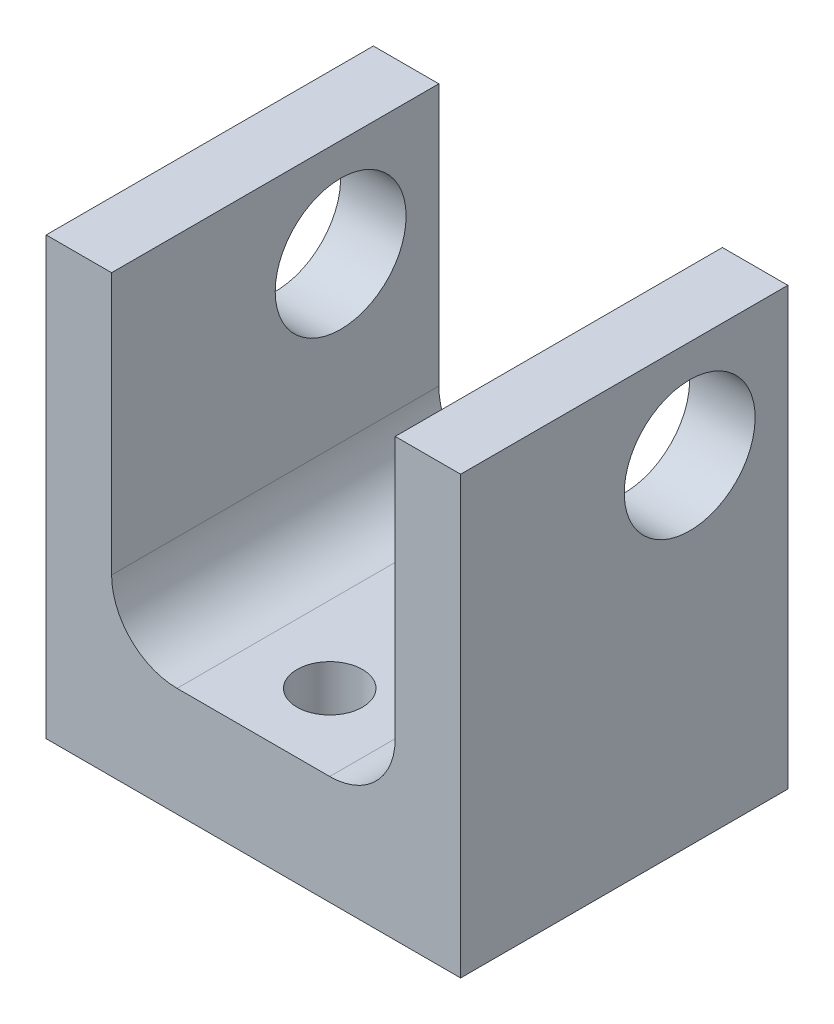
ISO-10303-21;
HEADER;
FILE_DESCRIPTION(('STEP AP214'),'2;1');
FILE_NAME('part.step','',(''),(''),'','','');
FILE_SCHEMA(('AUTOMOTIVE_DESIGN { 1 0 10303 214 1 1 1 1 }'));
ENDSEC;
DATA;
#1=APPLICATION_CONTEXT('core data for automotive mechanical design processes');
#2=APPLICATION_PROTOCOL_DEFINITION('international standard','automotive_design',2000,#1);
#3=PRODUCT_CONTEXT('',#1,'mechanical');
#4=PRODUCT('Part','Part','',(#3));
#5=PRODUCT_RELATED_PRODUCT_CATEGORY('part','',(#4));
#6=PRODUCT_DEFINITION_FORMATION('','',#4);
#7=PRODUCT_DEFINITION_CONTEXT('part definition',#1,'design');
#8=PRODUCT_DEFINITION('design','',#6,#7);
#9=PRODUCT_DEFINITION_SHAPE('','',#8);
#10=(LENGTH_UNIT() NAMED_UNIT(*) SI_UNIT(.MILLI.,.METRE.));
#11=(NAMED_UNIT(*) PLANE_ANGLE_UNIT() SI_UNIT($,.RADIAN.));
#12=(NAMED_UNIT(*) SI_UNIT($,.STERADIAN.) SOLID_ANGLE_UNIT());
#13=UNCERTAINTY_MEASURE_WITH_UNIT(LENGTH_MEASURE(1.E-05),#10,'distance_accuracy_value','');
#14=(GEOMETRIC_REPRESENTATION_CONTEXT(3) GLOBAL_UNCERTAINTY_ASSIGNED_CONTEXT((#13)) GLOBAL_UNIT_ASSIGNED_CONTEXT((#10,
#11,#12)) REPRESENTATION_CONTEXT('',''));
#15=CARTESIAN_POINT('',(0.,0.,0.));
#16=DIRECTION('',(0.,0.,1.));
#17=DIRECTION('',(1.,0.,0.));
#18=AXIS2_PLACEMENT_3D('',#15,#16,#17);
#19=CARTESIAN_POINT('',(9.5,0.,15.));
#20=DIRECTION('',(-1.,0.,0.));
#21=DIRECTION('',(0.,-1.,0.));
#22=AXIS2_PLACEMENT_3D('',#19,#20,#21);
#23=PLANE('',#22);
#24=CARTESIAN_POINT('',(9.49999999999999,15.5,4.5));
#25=DIRECTION('',(1.,0.,0.));
#26=DIRECTION('',(0.,1.,0.));
#27=AXIS2_PLACEMENT_3D('',#24,#25,#26);
#28=CIRCLE('',#27,3.);
#29=CARTESIAN_POINT('',(9.49999999999999,18.5,4.5));
#30=VERTEX_POINT('',#29);
#31=EDGE_CURVE('E174',#30,#30,#28,.T.);
#32=ORIENTED_EDGE('',*,*,#31,.F.);
#33=EDGE_LOOP('',(#32));
#34=FACE_BOUND('',#33,.T.);
#35=DIRECTION('',(0.,1.,0.));
#36=VECTOR('',#35,1.);
#37=CARTESIAN_POINT('',(9.5,0.,0.));
#38=LINE('',#37,#36);
#39=CARTESIAN_POINT('',(9.5,0.,0.));
#40=VERTEX_POINT('',#39);
#41=CARTESIAN_POINT('',(9.5,20.,0.));
#42=VERTEX_POINT('',#41);
#43=EDGE_CURVE('E143',#40,#42,#38,.T.);
#44=ORIENTED_EDGE('',*,*,#43,.T.);
#45=DIRECTION('',(0.,0.,-1.));
#46=VECTOR('',#45,1.);
#47=CARTESIAN_POINT('',(9.5,20.,15.));
#48=LINE('',#47,#46);
#49=CARTESIAN_POINT('',(9.5,20.,15.));
#50=VERTEX_POINT('',#49);
#51=EDGE_CURVE('E123',#50,#42,#48,.T.);
#52=ORIENTED_EDGE('',*,*,#51,.F.);
#53=DIRECTION('',(0.,1.,0.));
#54=VECTOR('',#53,1.);
#55=CARTESIAN_POINT('',(9.5,0.,15.));
#56=LINE('',#55,#54);
#57=CARTESIAN_POINT('',(9.5,0.,15.));
#58=VERTEX_POINT('',#57);
#59=EDGE_CURVE('E130',#58,#50,#56,.T.);
#60=ORIENTED_EDGE('',*,*,#59,.F.);
#61=DIRECTION('',(0.,0.,-1.));
#62=VECTOR('',#61,1.);
#63=CARTESIAN_POINT('',(9.5,0.,15.));
#64=LINE('',#63,#62);
#65=EDGE_CURVE('E220',#58,#40,#64,.T.);
#66=ORIENTED_EDGE('',*,*,#65,.T.);
#67=EDGE_LOOP('',(#44,#52,#60,#66));
#68=FACE_BOUND('',#67,.T.);
#69=ADVANCED_FACE('F39',(#34,#68),#23,.F.);
#70=CARTESIAN_POINT('',(9.5,20.,15.));
#71=DIRECTION('',(0.,-1.,0.));
#72=DIRECTION('',(1.,0.,0.));
#73=AXIS2_PLACEMENT_3D('',#70,#71,#72);
#74=PLANE('',#73);
#75=DIRECTION('',(-1.,0.,0.));
#76=VECTOR('',#75,1.);
#77=CARTESIAN_POINT('',(9.5,20.,0.));
#78=LINE('',#77,#76);
#79=CARTESIAN_POINT('',(6.5,20.,0.));
#80=VERTEX_POINT('',#79);
#81=EDGE_CURVE('E223',#42,#80,#78,.T.);
#82=ORIENTED_EDGE('',*,*,#81,.T.);
#83=DIRECTION('',(0.,0.,-1.));
#84=VECTOR('',#83,1.);
#85=CARTESIAN_POINT('',(6.5,20.,15.));
#86=LINE('',#85,#84);
#87=CARTESIAN_POINT('',(6.5,20.,15.));
#88=VERTEX_POINT('',#87);
#89=EDGE_CURVE('E126',#88,#80,#86,.T.);
#90=ORIENTED_EDGE('',*,*,#89,.F.);
#91=DIRECTION('',(-1.,0.,0.));
#92=VECTOR('',#91,1.);
#93=CARTESIAN_POINT('',(9.5,20.,15.));
#94=LINE('',#93,#92);
#95=EDGE_CURVE('E119',#50,#88,#94,.T.);
#96=ORIENTED_EDGE('',*,*,#95,.F.);
#97=ORIENTED_EDGE('',*,*,#51,.T.);
#98=EDGE_LOOP('',(#82,#90,#96,#97));
#99=FACE_BOUND('',#98,.T.);
#100=ADVANCED_FACE('F121',(#99),#74,.F.);
#101=CARTESIAN_POINT('',(6.5,20.,15.));
#102=DIRECTION('',(1.,0.,0.));
#103=DIRECTION('',(0.,1.,0.));
#104=AXIS2_PLACEMENT_3D('',#101,#102,#103);
#105=PLANE('',#104);
#106=CARTESIAN_POINT('',(6.5,15.5,4.5));
#107=DIRECTION('',(1.,0.,0.));
#108=DIRECTION('',(0.,1.,0.));
#109=AXIS2_PLACEMENT_3D('',#106,#107,#108);
#110=CIRCLE('',#109,3.);
#111=CARTESIAN_POINT('',(6.5,18.5,4.5));
#112=VERTEX_POINT('',#111);
#113=EDGE_CURVE('E199',#112,#112,#110,.T.);
#114=ORIENTED_EDGE('',*,*,#113,.T.);
#115=EDGE_LOOP('',(#114));
#116=FACE_BOUND('',#115,.T.);
#117=DIRECTION('',(0.,-1.,0.));
#118=VECTOR('',#117,1.);
#119=CARTESIAN_POINT('',(6.5,20.,0.));
#120=LINE('',#119,#118);
#121=CARTESIAN_POINT('',(6.5,8.,0.));
#122=VERTEX_POINT('',#121);
#123=EDGE_CURVE('E226',#80,#122,#120,.T.);
#124=ORIENTED_EDGE('',*,*,#123,.T.);
#125=DIRECTION('',(0.,0.,-1.));
#126=VECTOR('',#125,1.);
#127=CARTESIAN_POINT('',(6.5,8.,15.));
#128=LINE('',#127,#126);
#129=CARTESIAN_POINT('',(6.5,8.,15.));
#130=VERTEX_POINT('',#129);
#131=EDGE_CURVE('E57',#122,#130,#128,.F.);
#132=ORIENTED_EDGE('',*,*,#131,.T.);
#133=DIRECTION('',(0.,-1.,0.));
#134=VECTOR('',#133,1.);
#135=CARTESIAN_POINT('',(6.5,20.,15.));
#136=LINE('',#135,#134);
#137=EDGE_CURVE('E129',#88,#130,#136,.T.);
#138=ORIENTED_EDGE('',*,*,#137,.F.);
#139=ORIENTED_EDGE('',*,*,#89,.T.);
#140=EDGE_LOOP('',(#124,#132,#138,#139));
#141=FACE_BOUND('',#140,.T.);
#142=ADVANCED_FACE('F273',(#116,#141),#105,.F.);
#143=CARTESIAN_POINT('',(-6.5,5.,15.));
#144=DIRECTION('',(0.,-1.,0.));
#145=DIRECTION('',(1.,0.,0.));
#146=AXIS2_PLACEMENT_3D('',#143,#144,#145);
#147=PLANE('',#146);
#148=CARTESIAN_POINT('',(0.,5.,3.5));
#149=DIRECTION('',(0.,1.,0.));
#150=DIRECTION('',(0.,0.,-1.));
#151=AXIS2_PLACEMENT_3D('',#148,#149,#150);
#152=CIRCLE('',#151,1.5);
#153=CARTESIAN_POINT('',(0.,5.,2.));
#154=VERTEX_POINT('',#153);
#155=EDGE_CURVE('E189',#154,#154,#152,.T.);
#156=ORIENTED_EDGE('',*,*,#155,.F.);
#157=EDGE_LOOP('',(#156));
#158=FACE_BOUND('',#157,.T.);
#159=CARTESIAN_POINT('',(0.,5.,11.5));
#160=DIRECTION('',(0.,1.,0.));
#161=DIRECTION('',(0.,0.,1.));
#162=AXIS2_PLACEMENT_3D('',#159,#160,#161);
#163=CIRCLE('',#162,1.5);
#164=CARTESIAN_POINT('',(0.,5.,13.));
#165=VERTEX_POINT('',#164);
#166=EDGE_CURVE('E175',#165,#165,#163,.T.);
#167=ORIENTED_EDGE('',*,*,#166,.F.);
#168=EDGE_LOOP('',(#167));
#169=FACE_BOUND('',#168,.T.);
#170=DIRECTION('',(-1.,0.,0.));
#171=VECTOR('',#170,1.);
#172=CARTESIAN_POINT('',(-6.5,5.,0.));
#173=LINE('',#172,#171);
#174=CARTESIAN_POINT('',(3.5,5.,0.));
#175=VERTEX_POINT('',#174);
#176=CARTESIAN_POINT('',(-3.5,5.,0.));
#177=VERTEX_POINT('',#176);
#178=EDGE_CURVE('E229',#175,#177,#173,.T.);
#179=ORIENTED_EDGE('',*,*,#178,.T.);
#180=DIRECTION('',(0.,0.,-1.));
#181=VECTOR('',#180,1.);
#182=CARTESIAN_POINT('',(-3.5,5.,15.));
#183=LINE('',#182,#181);
#184=CARTESIAN_POINT('',(-3.5,5.,15.));
#185=VERTEX_POINT('',#184);
#186=EDGE_CURVE('E159',#177,#185,#183,.F.);
#187=ORIENTED_EDGE('',*,*,#186,.T.);
#188=DIRECTION('',(-1.,0.,0.));
#189=VECTOR('',#188,1.);
#190=CARTESIAN_POINT('',(-6.5,5.,15.));
#191=LINE('',#190,#189);
#192=CARTESIAN_POINT('',(3.5,5.,15.));
#193=VERTEX_POINT('',#192);
#194=EDGE_CURVE('E205',#193,#185,#191,.T.);
#195=ORIENTED_EDGE('',*,*,#194,.F.);
#196=DIRECTION('',(0.,0.,-1.));
#197=VECTOR('',#196,1.);
#198=CARTESIAN_POINT('',(3.5,5.,0.));
#199=LINE('',#198,#197);
#200=EDGE_CURVE('E150',#193,#175,#199,.T.);
#201=ORIENTED_EDGE('',*,*,#200,.T.);
#202=EDGE_LOOP('',(#179,#187,#195,#201));
#203=FACE_BOUND('',#202,.T.);
#204=ADVANCED_FACE('F279',(#158,#169,#203),#147,.F.);
#205=CARTESIAN_POINT('',(-6.5,20.,15.));
#206=DIRECTION('',(-1.,0.,0.));
#207=DIRECTION('',(0.,-1.,0.));
#208=AXIS2_PLACEMENT_3D('',#205,#206,#207);
#209=PLANE('',#208);
#210=CARTESIAN_POINT('',(-6.5,15.5,4.5));
#211=DIRECTION('',(-1.,0.,0.));
#212=DIRECTION('',(0.,-1.,0.));
#213=AXIS2_PLACEMENT_3D('',#210,#211,#212);
#214=CIRCLE('',#213,3.);
#215=CARTESIAN_POINT('',(-6.5,12.5,4.5));
#216=VERTEX_POINT('',#215);
#217=EDGE_CURVE('E194',#216,#216,#214,.T.);
#218=ORIENTED_EDGE('',*,*,#217,.T.);
#219=EDGE_LOOP('',(#218));
#220=FACE_BOUND('',#219,.T.);
#221=DIRECTION('',(0.,1.,0.));
#222=VECTOR('',#221,1.);
#223=CARTESIAN_POINT('',(-6.5,20.,15.));
#224=LINE('',#223,#222);
#225=CARTESIAN_POINT('',(-6.5,8.,15.));
#226=VERTEX_POINT('',#225);
#227=CARTESIAN_POINT('',(-6.5,20.,15.));
#228=VERTEX_POINT('',#227);
#229=EDGE_CURVE('E209',#226,#228,#224,.T.);
#230=ORIENTED_EDGE('',*,*,#229,.F.);
#231=DIRECTION('',(0.,0.,-1.));
#232=VECTOR('',#231,1.);
#233=CARTESIAN_POINT('',(-6.5,8.,0.));
#234=LINE('',#233,#232);
#235=CARTESIAN_POINT('',(-6.5,8.,0.));
#236=VERTEX_POINT('',#235);
#237=EDGE_CURVE('E145',#226,#236,#234,.T.);
#238=ORIENTED_EDGE('',*,*,#237,.T.);
#239=DIRECTION('',(0.,1.,0.));
#240=VECTOR('',#239,1.);
#241=CARTESIAN_POINT('',(-6.5,20.,0.));
#242=LINE('',#241,#240);
#243=CARTESIAN_POINT('',(-6.5,20.,0.));
#244=VERTEX_POINT('',#243);
#245=EDGE_CURVE('E233',#236,#244,#242,.T.);
#246=ORIENTED_EDGE('',*,*,#245,.T.);
#247=DIRECTION('',(0.,0.,-1.));
#248=VECTOR('',#247,1.);
#249=CARTESIAN_POINT('',(-6.5,20.,15.));
#250=LINE('',#249,#248);
#251=EDGE_CURVE('E152',#228,#244,#250,.T.);
#252=ORIENTED_EDGE('',*,*,#251,.F.);
#253=EDGE_LOOP('',(#230,#238,#246,#252));
#254=FACE_BOUND('',#253,.T.);
#255=ADVANCED_FACE('F285',(#220,#254),#209,.F.);
#256=CARTESIAN_POINT('',(-9.5,20.,15.));
#257=DIRECTION('',(0.,-1.,0.));
#258=DIRECTION('',(1.,0.,0.));
#259=AXIS2_PLACEMENT_3D('',#256,#257,#258);
#260=PLANE('',#259);
#261=DIRECTION('',(-1.,0.,0.));
#262=VECTOR('',#261,1.);
#263=CARTESIAN_POINT('',(-9.5,20.,0.));
#264=LINE('',#263,#262);
#265=CARTESIAN_POINT('',(-9.5,20.,0.));
#266=VERTEX_POINT('',#265);
#267=EDGE_CURVE('E236',#244,#266,#264,.T.);
#268=ORIENTED_EDGE('',*,*,#267,.T.);
#269=DIRECTION('',(0.,0.,-1.));
#270=VECTOR('',#269,1.);
#271=CARTESIAN_POINT('',(-9.5,20.,15.));
#272=LINE('',#271,#270);
#273=CARTESIAN_POINT('',(-9.5,20.,15.));
#274=VERTEX_POINT('',#273);
#275=EDGE_CURVE('E250',#274,#266,#272,.T.);
#276=ORIENTED_EDGE('',*,*,#275,.F.);
#277=DIRECTION('',(-1.,0.,0.));
#278=VECTOR('',#277,1.);
#279=CARTESIAN_POINT('',(-9.5,20.,15.));
#280=LINE('',#279,#278);
#281=EDGE_CURVE('E212',#228,#274,#280,.T.);
#282=ORIENTED_EDGE('',*,*,#281,.F.);
#283=ORIENTED_EDGE('',*,*,#251,.T.);
#284=EDGE_LOOP('',(#268,#276,#282,#283));
#285=FACE_BOUND('',#284,.T.);
#286=ADVANCED_FACE('F259',(#285),#260,.F.);
#287=CARTESIAN_POINT('',(-9.5,0.,15.));
#288=DIRECTION('',(1.,0.,0.));
#289=DIRECTION('',(0.,1.,0.));
#290=AXIS2_PLACEMENT_3D('',#287,#288,#289);
#291=PLANE('',#290);
#292=CARTESIAN_POINT('',(-9.50000000000001,15.5,4.5));
#293=DIRECTION('',(1.,0.,0.));
#294=DIRECTION('',(0.,1.,0.));
#295=AXIS2_PLACEMENT_3D('',#292,#293,#294);
#296=CIRCLE('',#295,3.);
#297=CARTESIAN_POINT('',(-9.50000000000001,18.5,4.5));
#298=VERTEX_POINT('',#297);
#299=EDGE_CURVE('E181',#298,#298,#296,.T.);
#300=ORIENTED_EDGE('',*,*,#299,.T.);
#301=EDGE_LOOP('',(#300));
#302=FACE_BOUND('',#301,.T.);
#303=DIRECTION('',(0.,-1.,0.));
#304=VECTOR('',#303,1.);
#305=CARTESIAN_POINT('',(-9.5,0.,0.));
#306=LINE('',#305,#304);
#307=CARTESIAN_POINT('',(-9.5,0.,0.));
#308=VERTEX_POINT('',#307);
#309=EDGE_CURVE('E239',#266,#308,#306,.T.);
#310=ORIENTED_EDGE('',*,*,#309,.T.);
#311=DIRECTION('',(0.,0.,-1.));
#312=VECTOR('',#311,1.);
#313=CARTESIAN_POINT('',(-9.5,0.,15.));
#314=LINE('',#313,#312);
#315=CARTESIAN_POINT('',(-9.5,0.,15.));
#316=VERTEX_POINT('',#315);
#317=EDGE_CURVE('E246',#316,#308,#314,.T.);
#318=ORIENTED_EDGE('',*,*,#317,.F.);
#319=DIRECTION('',(0.,-1.,0.));
#320=VECTOR('',#319,1.);
#321=CARTESIAN_POINT('',(-9.5,0.,15.));
#322=LINE('',#321,#320);
#323=EDGE_CURVE('E215',#274,#316,#322,.T.);
#324=ORIENTED_EDGE('',*,*,#323,.F.);
#325=ORIENTED_EDGE('',*,*,#275,.T.);
#326=EDGE_LOOP('',(#310,#318,#324,#325));
#327=FACE_BOUND('',#326,.T.);
#328=ADVANCED_FACE('F269',(#302,#327),#291,.F.);
#329=CARTESIAN_POINT('',(9.5,0.,15.));
#330=DIRECTION('',(0.,1.,0.));
#331=DIRECTION('',(-1.,0.,0.));
#332=AXIS2_PLACEMENT_3D('',#329,#330,#331);
#333=PLANE('',#332);
#334=CARTESIAN_POINT('',(0.,0.,3.5));
#335=DIRECTION('',(0.,1.,0.));
#336=DIRECTION('',(-1.,0.,0.));
#337=AXIS2_PLACEMENT_3D('',#334,#335,#336);
#338=CIRCLE('',#337,1.5);
#339=CARTESIAN_POINT('',(-1.5,0.,3.5));
#340=VERTEX_POINT('',#339);
#341=EDGE_CURVE('E43',#340,#340,#338,.T.);
#342=ORIENTED_EDGE('',*,*,#341,.T.);
#343=EDGE_LOOP('',(#342));
#344=FACE_BOUND('',#343,.T.);
#345=CARTESIAN_POINT('',(0.,0.,11.5));
#346=DIRECTION('',(0.,1.,0.));
#347=DIRECTION('',(-1.,0.,0.));
#348=AXIS2_PLACEMENT_3D('',#345,#346,#347);
#349=CIRCLE('',#348,1.5);
#350=CARTESIAN_POINT('',(-1.5,0.,11.5));
#351=VERTEX_POINT('',#350);
#352=EDGE_CURVE('E171',#351,#351,#349,.T.);
#353=ORIENTED_EDGE('',*,*,#352,.T.);
#354=EDGE_LOOP('',(#353));
#355=FACE_BOUND('',#354,.T.);
#356=DIRECTION('',(1.,0.,0.));
#357=VECTOR('',#356,1.);
#358=CARTESIAN_POINT('',(9.5,0.,0.));
#359=LINE('',#358,#357);
#360=EDGE_CURVE('E140',#308,#40,#359,.T.);
#361=ORIENTED_EDGE('',*,*,#360,.T.);
#362=ORIENTED_EDGE('',*,*,#65,.F.);
#363=DIRECTION('',(1.,0.,0.));
#364=VECTOR('',#363,1.);
#365=CARTESIAN_POINT('',(9.5,0.,15.));
#366=LINE('',#365,#364);
#367=EDGE_CURVE('E135',#316,#58,#366,.T.);
#368=ORIENTED_EDGE('',*,*,#367,.F.);
#369=ORIENTED_EDGE('',*,*,#317,.T.);
#370=EDGE_LOOP('',(#361,#362,#368,#369));
#371=FACE_BOUND('',#370,.T.);
#372=ADVANCED_FACE('F272',(#344,#355,#371),#333,.F.);
#373=CARTESIAN_POINT('',(0.,0.,15.));
#374=DIRECTION('',(0.,0.,1.));
#375=DIRECTION('',(1.,0.,0.));
#376=AXIS2_PLACEMENT_3D('',#373,#374,#375);
#377=PLANE('',#376);
#378=ORIENTED_EDGE('',*,*,#59,.T.);
#379=ORIENTED_EDGE('',*,*,#95,.T.);
#380=ORIENTED_EDGE('',*,*,#137,.T.);
#381=CARTESIAN_POINT('',(3.5,8.,15.));
#382=DIRECTION('',(0.,0.,1.));
#383=DIRECTION('',(1.,0.,0.));
#384=AXIS2_PLACEMENT_3D('',#381,#382,#383);
#385=CIRCLE('',#384,3.);
#386=EDGE_CURVE('E11',#130,#193,#385,.F.);
#387=ORIENTED_EDGE('',*,*,#386,.T.);
#388=ORIENTED_EDGE('',*,*,#194,.T.);
#389=CARTESIAN_POINT('',(-3.5,8.,15.));
#390=DIRECTION('',(0.,0.,1.));
#391=DIRECTION('',(1.,0.,0.));
#392=AXIS2_PLACEMENT_3D('',#389,#390,#391);
#393=CIRCLE('',#392,3.);
#394=EDGE_CURVE('E167',#185,#226,#393,.F.);
#395=ORIENTED_EDGE('',*,*,#394,.T.);
#396=ORIENTED_EDGE('',*,*,#229,.T.);
#397=ORIENTED_EDGE('',*,*,#281,.T.);
#398=ORIENTED_EDGE('',*,*,#323,.T.);
#399=ORIENTED_EDGE('',*,*,#367,.T.);
#400=EDGE_LOOP('',(#378,#379,#380,#387,#388,#395,#396,#397,#398,#399));
#401=FACE_BOUND('',#400,.T.);
#402=ADVANCED_FACE('F133',(#401),#377,.T.);
#403=CARTESIAN_POINT('',(0.,0.,0.));
#404=DIRECTION('',(0.,0.,1.));
#405=DIRECTION('',(1.,0.,0.));
#406=AXIS2_PLACEMENT_3D('',#403,#404,#405);
#407=PLANE('',#406);
#408=ORIENTED_EDGE('',*,*,#43,.F.);
#409=ORIENTED_EDGE('',*,*,#360,.F.);
#410=ORIENTED_EDGE('',*,*,#309,.F.);
#411=ORIENTED_EDGE('',*,*,#267,.F.);
#412=ORIENTED_EDGE('',*,*,#245,.F.);
#413=CARTESIAN_POINT('',(-3.5,8.,0.));
#414=DIRECTION('',(0.,0.,1.));
#415=DIRECTION('',(1.,0.,0.));
#416=AXIS2_PLACEMENT_3D('',#413,#414,#415);
#417=CIRCLE('',#416,3.);
#418=EDGE_CURVE('E164',#236,#177,#417,.T.);
#419=ORIENTED_EDGE('',*,*,#418,.T.);
#420=ORIENTED_EDGE('',*,*,#178,.F.);
#421=CARTESIAN_POINT('',(3.5,8.,0.));
#422=DIRECTION('',(0.,0.,1.));
#423=DIRECTION('',(1.,0.,0.));
#424=AXIS2_PLACEMENT_3D('',#421,#422,#423);
#425=CIRCLE('',#424,3.);
#426=EDGE_CURVE('E49',#175,#122,#425,.T.);
#427=ORIENTED_EDGE('',*,*,#426,.T.);
#428=ORIENTED_EDGE('',*,*,#123,.F.);
#429=ORIENTED_EDGE('',*,*,#81,.F.);
#430=EDGE_LOOP('',(#408,#409,#410,#411,#412,#419,#420,#427,#428,#429));
#431=FACE_BOUND('',#430,.T.);
#432=ADVANCED_FACE('F265',(#431),#407,.F.);
#433=CARTESIAN_POINT('',(-3.5,8.,15.));
#434=DIRECTION('',(0.,0.,1.));
#435=DIRECTION('',(1.,0.,0.));
#436=AXIS2_PLACEMENT_3D('',#433,#434,#435);
#437=CYLINDRICAL_SURFACE('',#436,3.);
#438=ORIENTED_EDGE('',*,*,#394,.F.);
#439=ORIENTED_EDGE('',*,*,#186,.F.);
#440=ORIENTED_EDGE('',*,*,#418,.F.);
#441=ORIENTED_EDGE('',*,*,#237,.F.);
#442=EDGE_LOOP('',(#438,#439,#440,#441));
#443=FACE_BOUND('',#442,.T.);
#444=ADVANCED_FACE('F284',(#443),#437,.F.);
#445=CARTESIAN_POINT('',(3.5,8.,15.));
#446=DIRECTION('',(0.,0.,1.));
#447=DIRECTION('',(1.,0.,0.));
#448=AXIS2_PLACEMENT_3D('',#445,#446,#447);
#449=CYLINDRICAL_SURFACE('',#448,3.);
#450=ORIENTED_EDGE('',*,*,#386,.F.);
#451=ORIENTED_EDGE('',*,*,#131,.F.);
#452=ORIENTED_EDGE('',*,*,#426,.F.);
#453=ORIENTED_EDGE('',*,*,#200,.F.);
#454=EDGE_LOOP('',(#450,#451,#452,#453));
#455=FACE_BOUND('',#454,.T.);
#456=ADVANCED_FACE('F41',(#455),#449,.F.);
#457=CARTESIAN_POINT('',(-9.50000000000001,15.5,4.5));
#458=DIRECTION('',(1.,0.,0.));
#459=DIRECTION('',(0.,1.,0.));
#460=AXIS2_PLACEMENT_3D('',#457,#458,#459);
#461=CYLINDRICAL_SURFACE('',#460,3.);
#462=ORIENTED_EDGE('',*,*,#299,.F.);
#463=EDGE_LOOP('',(#462));
#464=FACE_BOUND('',#463,.T.);
#465=ORIENTED_EDGE('',*,*,#217,.F.);
#466=EDGE_LOOP('',(#465));
#467=FACE_BOUND('',#466,.T.);
#468=ADVANCED_FACE('F310',(#464,#467),#461,.F.);
#469=ORIENTED_EDGE('',*,*,#31,.T.);
#470=EDGE_LOOP('',(#469));
#471=FACE_BOUND('',#470,.T.);
#472=ORIENTED_EDGE('',*,*,#113,.F.);
#473=EDGE_LOOP('',(#472));
#474=FACE_BOUND('',#473,.T.);
#475=ADVANCED_FACE('F329',(#471,#474),#461,.F.);
#476=CARTESIAN_POINT('',(0.,-5.,11.5));
#477=DIRECTION('',(0.,1.,0.));
#478=DIRECTION('',(0.,0.,1.));
#479=AXIS2_PLACEMENT_3D('',#476,#477,#478);
#480=CYLINDRICAL_SURFACE('',#479,1.5);
#481=ORIENTED_EDGE('',*,*,#166,.T.);
#482=EDGE_LOOP('',(#481));
#483=FACE_BOUND('',#482,.T.);
#484=ORIENTED_EDGE('',*,*,#352,.F.);
#485=EDGE_LOOP('',(#484));
#486=FACE_BOUND('',#485,.T.);
#487=ADVANCED_FACE('F334',(#483,#486),#480,.F.);
#488=CARTESIAN_POINT('',(0.,-5.,3.5));
#489=DIRECTION('',(0.,1.,0.));
#490=DIRECTION('',(0.,0.,1.));
#491=AXIS2_PLACEMENT_3D('',#488,#489,#490);
#492=CYLINDRICAL_SURFACE('',#491,1.5);
#493=ORIENTED_EDGE('',*,*,#155,.T.);
#494=EDGE_LOOP('',(#493));
#495=FACE_BOUND('',#494,.T.);
#496=ORIENTED_EDGE('',*,*,#341,.F.);
#497=EDGE_LOOP('',(#496));
#498=FACE_BOUND('',#497,.T.);
#499=ADVANCED_FACE('F339',(#495,#498),#492,.F.);
#500=CLOSED_SHELL('',(#69,#100,#142,#204,#255,#286,#328,#372,#402,#432,#444,#456,#468,#475,#487,#499));
#501=MANIFOLD_SOLID_BREP('B2',#500);
#502=ADVANCED_BREP_SHAPE_REPRESENTATION('',(#18,#501),#14);
#503=SHAPE_DEFINITION_REPRESENTATION(#9,#502);
ENDSEC;
END-ISO-10303-21;
